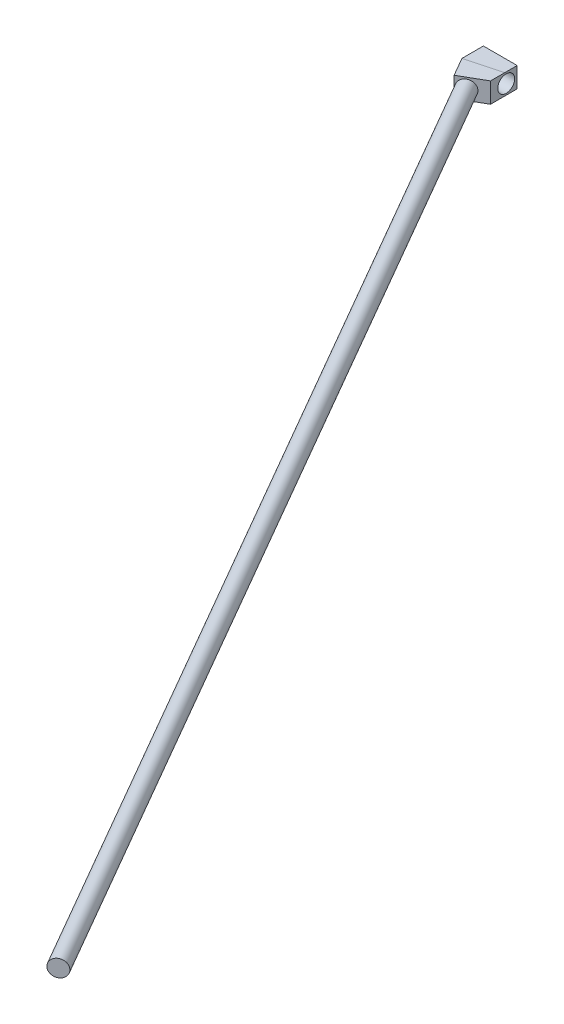
ISO-10303-21;
HEADER;
FILE_DESCRIPTION(('STEP AP214'),'2;1');
FILE_NAME('part.step','',(''),(''),'','','');
FILE_SCHEMA(('AUTOMOTIVE_DESIGN { 1 0 10303 214 1 1 1 1 }'));
ENDSEC;
DATA;
#1=APPLICATION_CONTEXT('core data for automotive mechanical design processes');
#2=APPLICATION_PROTOCOL_DEFINITION('international standard','automotive_design',2000,#1);
#3=PRODUCT_CONTEXT('',#1,'mechanical');
#4=PRODUCT('Part','Part','',(#3));
#5=PRODUCT_RELATED_PRODUCT_CATEGORY('part','',(#4));
#6=PRODUCT_DEFINITION_FORMATION('','',#4);
#7=PRODUCT_DEFINITION_CONTEXT('part definition',#1,'design');
#8=PRODUCT_DEFINITION('design','',#6,#7);
#9=PRODUCT_DEFINITION_SHAPE('','',#8);
#10=(LENGTH_UNIT() NAMED_UNIT(*) SI_UNIT(.MILLI.,.METRE.));
#11=(NAMED_UNIT(*) PLANE_ANGLE_UNIT() SI_UNIT($,.RADIAN.));
#12=(NAMED_UNIT(*) SI_UNIT($,.STERADIAN.) SOLID_ANGLE_UNIT());
#13=UNCERTAINTY_MEASURE_WITH_UNIT(LENGTH_MEASURE(1.E-05),#10,'distance_accuracy_value','');
#14=(GEOMETRIC_REPRESENTATION_CONTEXT(3) GLOBAL_UNCERTAINTY_ASSIGNED_CONTEXT((#13)) GLOBAL_UNIT_ASSIGNED_CONTEXT((#10,
#11,#12)) REPRESENTATION_CONTEXT('',''));
#15=CARTESIAN_POINT('',(0.,0.,0.));
#16=DIRECTION('',(0.,0.,1.));
#17=DIRECTION('',(1.,0.,0.));
#18=AXIS2_PLACEMENT_3D('',#15,#16,#17);
#19=CARTESIAN_POINT('',(2.50000000000001,0.,9.33012701892219));
#20=DIRECTION('',(0.500000000000001,0.,0.866025403784438));
#21=DIRECTION('',(0.866025403784438,0.,-0.500000000000001));
#22=AXIS2_PLACEMENT_3D('',#19,#20,#21);
#23=PLANE('',#22);
#24=CARTESIAN_POINT('',(0.475819659514536,0.,10.4987880833898));
#25=DIRECTION('',(0.500000000000001,0.,0.866025403784438));
#26=DIRECTION('',(0.866025403784438,0.,-0.500000000000001));
#27=AXIS2_PLACEMENT_3D('',#24,#25,#26);
#28=CIRCLE('',#27,2.5);
#29=CARTESIAN_POINT('',(2.64088316897563,0.,9.24878808338983));
#30=VERTEX_POINT('',#29);
#31=EDGE_CURVE('E12',#30,#30,#28,.T.);
#32=ORIENTED_EDGE('',*,*,#31,.F.);
#33=EDGE_LOOP('',(#32));
#34=FACE_BOUND('',#33,.T.);
#35=DIRECTION('',(0.866025403784438,0.,-0.500000000000001));
#36=VECTOR('',#35,1.);
#37=CARTESIAN_POINT('',(-1.83012701892218,-3.,11.8301270189222));
#38=LINE('',#37,#36);
#39=CARTESIAN_POINT('',(-1.83012701892218,-3.,11.8301270189222));
#40=VERTEX_POINT('',#39);
#41=CARTESIAN_POINT('',(5.,-3.,7.88675134594812));
#42=VERTEX_POINT('',#41);
#43=EDGE_CURVE('E126',#40,#42,#38,.T.);
#44=ORIENTED_EDGE('',*,*,#43,.T.);
#45=DIRECTION('',(0.,1.,0.));
#46=VECTOR('',#45,1.);
#47=CARTESIAN_POINT('',(5.,0.,7.88675134594813));
#48=LINE('',#47,#46);
#49=CARTESIAN_POINT('',(5.,3.,7.88675134594813));
#50=VERTEX_POINT('',#49);
#51=EDGE_CURVE('E56',#42,#50,#48,.T.);
#52=ORIENTED_EDGE('',*,*,#51,.T.);
#53=DIRECTION('',(-0.866025403784438,0.,0.500000000000001));
#54=VECTOR('',#53,1.);
#55=CARTESIAN_POINT('',(-1.83012701892218,3.,11.8301270189222));
#56=LINE('',#55,#54);
#57=CARTESIAN_POINT('',(-1.83012701892218,3.,11.8301270189222));
#58=VERTEX_POINT('',#57);
#59=EDGE_CURVE('E124',#50,#58,#56,.T.);
#60=ORIENTED_EDGE('',*,*,#59,.T.);
#61=DIRECTION('',(0.,-1.,0.));
#62=VECTOR('',#61,1.);
#63=CARTESIAN_POINT('',(-1.83012701892218,3.,11.8301270189222));
#64=LINE('',#63,#62);
#65=EDGE_CURVE('E129',#58,#40,#64,.T.);
#66=ORIENTED_EDGE('',*,*,#65,.T.);
#67=EDGE_LOOP('',(#44,#52,#60,#66));
#68=FACE_BOUND('',#67,.T.);
#69=ADVANCED_FACE('F33',(#34,#68),#23,.T.);
#70=CARTESIAN_POINT('',(-5.11698729810778,-3.,6.13711801799273));
#71=DIRECTION('',(0.,-1.,0.));
#72=DIRECTION('',(0.,0.,-1.));
#73=AXIS2_PLACEMENT_3D('',#70,#71,#72);
#74=PLANE('',#73);
#75=DIRECTION('',(-0.965925826289068,0.,0.258819045102522));
#76=VECTOR('',#75,1.);
#77=CARTESIAN_POINT('',(-3.41506350946109,-3.,5.9150635094611));
#78=LINE('',#77,#76);
#79=CARTESIAN_POINT('',(5.,-3.,3.66025403784438));
#80=VERTEX_POINT('',#79);
#81=CARTESIAN_POINT('',(-5.,-3.,6.33974596215562));
#82=VERTEX_POINT('',#81);
#83=EDGE_CURVE('E41',#80,#82,#78,.T.);
#84=ORIENTED_EDGE('',*,*,#83,.F.);
#85=DIRECTION('',(0.,0.,1.));
#86=VECTOR('',#85,1.);
#87=CARTESIAN_POINT('',(5.,-3.,6.13711801799273));
#88=LINE('',#87,#86);
#89=EDGE_CURVE('E49',#80,#42,#88,.T.);
#90=ORIENTED_EDGE('',*,*,#89,.T.);
#91=ORIENTED_EDGE('',*,*,#43,.F.);
#92=DIRECTION('',(0.500000000000001,0.,0.866025403784438));
#93=VECTOR('',#92,1.);
#94=CARTESIAN_POINT('',(-5.11698729810778,-3.,6.13711801799273));
#95=LINE('',#94,#93);
#96=EDGE_CURVE('E130',#82,#40,#95,.T.);
#97=ORIENTED_EDGE('',*,*,#96,.F.);
#98=EDGE_LOOP('',(#84,#90,#91,#97));
#99=FACE_BOUND('',#98,.T.);
#100=ADVANCED_FACE('F141',(#99),#74,.T.);
#101=CARTESIAN_POINT('',(-5.11698729810778,3.,6.13711801799274));
#102=DIRECTION('',(0.,1.,0.));
#103=DIRECTION('',(0.,0.,1.));
#104=AXIS2_PLACEMENT_3D('',#101,#102,#103);
#105=PLANE('',#104);
#106=ORIENTED_EDGE('',*,*,#59,.F.);
#107=DIRECTION('',(0.,0.,-1.));
#108=VECTOR('',#107,1.);
#109=CARTESIAN_POINT('',(5.,3.,6.13711801799274));
#110=LINE('',#109,#108);
#111=CARTESIAN_POINT('',(5.,3.,3.66025403784438));
#112=VERTEX_POINT('',#111);
#113=EDGE_CURVE('E154',#50,#112,#110,.T.);
#114=ORIENTED_EDGE('',*,*,#113,.T.);
#115=DIRECTION('',(0.965925826289068,0.,-0.258819045102522));
#116=VECTOR('',#115,1.);
#117=CARTESIAN_POINT('',(-3.41506350946109,3.,5.9150635094611));
#118=LINE('',#117,#116);
#119=CARTESIAN_POINT('',(-5.,3.,6.33974596215562));
#120=VERTEX_POINT('',#119);
#121=EDGE_CURVE('E123',#120,#112,#118,.T.);
#122=ORIENTED_EDGE('',*,*,#121,.F.);
#123=DIRECTION('',(0.500000000000001,0.,0.866025403784438));
#124=VECTOR('',#123,1.);
#125=CARTESIAN_POINT('',(-5.11698729810778,3.,6.13711801799274));
#126=LINE('',#125,#124);
#127=EDGE_CURVE('E36',#120,#58,#126,.T.);
#128=ORIENTED_EDGE('',*,*,#127,.T.);
#129=EDGE_LOOP('',(#106,#114,#122,#128));
#130=FACE_BOUND('',#129,.T.);
#131=ADVANCED_FACE('F138',(#130),#105,.T.);
#132=CARTESIAN_POINT('',(6.8301270189222,0.,3.24577679774052));
#133=DIRECTION('',(-1.,0.,0.));
#134=DIRECTION('',(0.,-1.,0.));
#135=AXIS2_PLACEMENT_3D('',#132,#133,#134);
#136=CYLINDRICAL_SURFACE('',#135,2.5);
#137=CARTESIAN_POINT('',(-5.,0.,3.24577679774052));
#138=DIRECTION('',(-1.,0.,0.));
#139=DIRECTION('',(0.,-1.,0.));
#140=AXIS2_PLACEMENT_3D('',#137,#138,#139);
#141=CIRCLE('',#140,2.5);
#142=CARTESIAN_POINT('',(-5.,-2.5,3.24577679774052));
#143=VERTEX_POINT('',#142);
#144=EDGE_CURVE('E151',#143,#143,#141,.T.);
#145=ORIENTED_EDGE('',*,*,#144,.T.);
#146=EDGE_LOOP('',(#145));
#147=FACE_BOUND('',#146,.T.);
#148=CARTESIAN_POINT('',(5.,0.,3.24577679774052));
#149=DIRECTION('',(1.,0.,0.));
#150=DIRECTION('',(0.,1.,0.));
#151=AXIS2_PLACEMENT_3D('',#148,#149,#150);
#152=CIRCLE('',#151,2.5);
#153=CARTESIAN_POINT('',(5.,2.5,3.24577679774052));
#154=VERTEX_POINT('',#153);
#155=EDGE_CURVE('E127',#154,#154,#152,.T.);
#156=ORIENTED_EDGE('',*,*,#155,.T.);
#157=EDGE_LOOP('',(#156));
#158=FACE_BOUND('',#157,.T.);
#159=ADVANCED_FACE('F178',(#147,#158),#136,.F.);
#160=CARTESIAN_POINT('',(0.,0.,0.));
#161=DIRECTION('',(0.,0.,1.));
#162=DIRECTION('',(1.,0.,0.));
#163=AXIS2_PLACEMENT_3D('',#160,#161,#162);
#164=PLANE('',#163);
#165=DIRECTION('',(0.,1.,0.));
#166=VECTOR('',#165,1.);
#167=CARTESIAN_POINT('',(5.,3.,0.));
#168=LINE('',#167,#166);
#169=CARTESIAN_POINT('',(5.,-3.,0.));
#170=VERTEX_POINT('',#169);
#171=CARTESIAN_POINT('',(5.,3.,0.));
#172=VERTEX_POINT('',#171);
#173=EDGE_CURVE('E107',#170,#172,#168,.T.);
#174=ORIENTED_EDGE('',*,*,#173,.F.);
#175=DIRECTION('',(1.,0.,0.));
#176=VECTOR('',#175,1.);
#177=CARTESIAN_POINT('',(-5.,-3.,0.));
#178=LINE('',#177,#176);
#179=CARTESIAN_POINT('',(-5.,-3.,0.));
#180=VERTEX_POINT('',#179);
#181=EDGE_CURVE('E93',#180,#170,#178,.T.);
#182=ORIENTED_EDGE('',*,*,#181,.F.);
#183=DIRECTION('',(0.,-1.,0.));
#184=VECTOR('',#183,1.);
#185=CARTESIAN_POINT('',(-5.,3.,0.));
#186=LINE('',#185,#184);
#187=CARTESIAN_POINT('',(-5.,3.,0.));
#188=VERTEX_POINT('',#187);
#189=EDGE_CURVE('E87',#188,#180,#186,.T.);
#190=ORIENTED_EDGE('',*,*,#189,.F.);
#191=DIRECTION('',(-1.,0.,0.));
#192=VECTOR('',#191,1.);
#193=CARTESIAN_POINT('',(-5.,3.,0.));
#194=LINE('',#193,#192);
#195=EDGE_CURVE('E90',#172,#188,#194,.T.);
#196=ORIENTED_EDGE('',*,*,#195,.F.);
#197=EDGE_LOOP('',(#174,#182,#190,#196));
#198=FACE_BOUND('',#197,.T.);
#199=ADVANCED_FACE('F89',(#198),#164,.F.);
#200=CARTESIAN_POINT('',(-5.11698729810778,3.,6.13711801799274));
#201=DIRECTION('',(-0.866025403784438,0.,0.500000000000001));
#202=DIRECTION('',(0.500000000000001,0.,0.866025403784438));
#203=AXIS2_PLACEMENT_3D('',#200,#201,#202);
#204=PLANE('',#203);
#205=DIRECTION('',(0.,1.,0.));
#206=VECTOR('',#205,1.);
#207=CARTESIAN_POINT('',(-5.,3.,6.33974596215562));
#208=LINE('',#207,#206);
#209=EDGE_CURVE('E111',#82,#120,#208,.T.);
#210=ORIENTED_EDGE('',*,*,#209,.F.);
#211=ORIENTED_EDGE('',*,*,#96,.T.);
#212=ORIENTED_EDGE('',*,*,#65,.F.);
#213=ORIENTED_EDGE('',*,*,#127,.F.);
#214=EDGE_LOOP('',(#210,#211,#212,#213));
#215=FACE_BOUND('',#214,.T.);
#216=ADVANCED_FACE('F140',(#215),#204,.T.);
#217=CARTESIAN_POINT('',(-5.,3.,0.));
#218=DIRECTION('',(0.,1.,0.));
#219=DIRECTION('',(0.,0.,1.));
#220=AXIS2_PLACEMENT_3D('',#217,#218,#219);
#221=PLANE('',#220);
#222=DIRECTION('',(0.,0.,1.));
#223=VECTOR('',#222,1.);
#224=CARTESIAN_POINT('',(-5.,3.,0.));
#225=LINE('',#224,#223);
#226=EDGE_CURVE('E104',#188,#120,#225,.T.);
#227=ORIENTED_EDGE('',*,*,#226,.T.);
#228=ORIENTED_EDGE('',*,*,#121,.T.);
#229=DIRECTION('',(0.,0.,1.));
#230=VECTOR('',#229,1.);
#231=CARTESIAN_POINT('',(5.,3.,0.));
#232=LINE('',#231,#230);
#233=EDGE_CURVE('E106',#172,#112,#232,.T.);
#234=ORIENTED_EDGE('',*,*,#233,.F.);
#235=ORIENTED_EDGE('',*,*,#195,.T.);
#236=EDGE_LOOP('',(#227,#228,#234,#235));
#237=FACE_BOUND('',#236,.T.);
#238=ADVANCED_FACE('F102',(#237),#221,.T.);
#239=CARTESIAN_POINT('',(5.,3.,0.));
#240=DIRECTION('',(1.,0.,0.));
#241=DIRECTION('',(0.,1.,0.));
#242=AXIS2_PLACEMENT_3D('',#239,#240,#241);
#243=PLANE('',#242);
#244=ORIENTED_EDGE('',*,*,#89,.F.);
#245=DIRECTION('',(0.,0.,1.));
#246=VECTOR('',#245,1.);
#247=CARTESIAN_POINT('',(5.,-3.,0.));
#248=LINE('',#247,#246);
#249=EDGE_CURVE('E114',#170,#80,#248,.T.);
#250=ORIENTED_EDGE('',*,*,#249,.F.);
#251=ORIENTED_EDGE('',*,*,#173,.T.);
#252=ORIENTED_EDGE('',*,*,#233,.T.);
#253=ORIENTED_EDGE('',*,*,#113,.F.);
#254=ORIENTED_EDGE('',*,*,#51,.F.);
#255=EDGE_LOOP('',(#244,#250,#251,#252,#253,#254));
#256=FACE_BOUND('',#255,.T.);
#257=ORIENTED_EDGE('',*,*,#155,.F.);
#258=EDGE_LOOP('',(#257));
#259=FACE_BOUND('',#258,.T.);
#260=ADVANCED_FACE('F198',(#256,#259),#243,.T.);
#261=CARTESIAN_POINT('',(-5.,-3.,0.));
#262=DIRECTION('',(0.,-1.,0.));
#263=DIRECTION('',(0.,0.,-1.));
#264=AXIS2_PLACEMENT_3D('',#261,#262,#263);
#265=PLANE('',#264);
#266=ORIENTED_EDGE('',*,*,#249,.T.);
#267=ORIENTED_EDGE('',*,*,#83,.T.);
#268=DIRECTION('',(0.,0.,1.));
#269=VECTOR('',#268,1.);
#270=CARTESIAN_POINT('',(-5.,-3.,0.));
#271=LINE('',#270,#269);
#272=EDGE_CURVE('E112',#180,#82,#271,.T.);
#273=ORIENTED_EDGE('',*,*,#272,.F.);
#274=ORIENTED_EDGE('',*,*,#181,.T.);
#275=EDGE_LOOP('',(#266,#267,#273,#274));
#276=FACE_BOUND('',#275,.T.);
#277=ADVANCED_FACE('F144',(#276),#265,.T.);
#278=CARTESIAN_POINT('',(-5.,3.,0.));
#279=DIRECTION('',(-1.,0.,0.));
#280=DIRECTION('',(0.,-1.,0.));
#281=AXIS2_PLACEMENT_3D('',#278,#279,#280);
#282=PLANE('',#281);
#283=ORIENTED_EDGE('',*,*,#144,.F.);
#284=EDGE_LOOP('',(#283));
#285=FACE_BOUND('',#284,.T.);
#286=ORIENTED_EDGE('',*,*,#272,.T.);
#287=ORIENTED_EDGE('',*,*,#209,.T.);
#288=ORIENTED_EDGE('',*,*,#226,.F.);
#289=ORIENTED_EDGE('',*,*,#189,.T.);
#290=EDGE_LOOP('',(#286,#287,#288,#289));
#291=FACE_BOUND('',#290,.T.);
#292=ADVANCED_FACE('F110',(#285,#291),#282,.T.);
#293=CARTESIAN_POINT('',(165.475819659515,0.,296.287171332254));
#294=DIRECTION('',(-0.500000000000001,0.,-0.866025403784438));
#295=DIRECTION('',(-0.866025403784438,0.,0.500000000000001));
#296=AXIS2_PLACEMENT_3D('',#293,#294,#295);
#297=CYLINDRICAL_SURFACE('',#296,2.5);
#298=CARTESIAN_POINT('',(165.475819659515,0.,296.287171332254));
#299=DIRECTION('',(0.500000000000001,0.,0.866025403784438));
#300=DIRECTION('',(0.866025403784438,0.,-0.500000000000001));
#301=AXIS2_PLACEMENT_3D('',#298,#299,#300);
#302=CIRCLE('',#301,2.5);
#303=CARTESIAN_POINT('',(167.640883168976,0.,295.037171332254));
#304=VERTEX_POINT('',#303);
#305=EDGE_CURVE('E157',#304,#304,#302,.T.);
#306=ORIENTED_EDGE('',*,*,#305,.F.);
#307=EDGE_LOOP('',(#306));
#308=FACE_BOUND('',#307,.T.);
#309=ORIENTED_EDGE('',*,*,#31,.T.);
#310=EDGE_LOOP('',(#309));
#311=FACE_BOUND('',#310,.T.);
#312=ADVANCED_FACE('F164',(#308,#311),#297,.T.);
#313=CARTESIAN_POINT('',(165.475819659515,0.,296.287171332254));
#314=DIRECTION('',(0.500000000000001,0.,0.866025403784438));
#315=DIRECTION('',(0.866025403784438,0.,-0.500000000000001));
#316=AXIS2_PLACEMENT_3D('',#313,#314,#315);
#317=PLANE('',#316);
#318=ORIENTED_EDGE('',*,*,#305,.T.);
#319=EDGE_LOOP('',(#318));
#320=FACE_BOUND('',#319,.T.);
#321=ADVANCED_FACE('F162',(#320),#317,.T.);
#322=CLOSED_SHELL('',(#69,#100,#131,#159,#199,#216,#238,#260,#277,#292,#312,#321));
#323=MANIFOLD_SOLID_BREP('B2',#322);
#324=ADVANCED_BREP_SHAPE_REPRESENTATION('',(#18,#323),#14);
#325=SHAPE_DEFINITION_REPRESENTATION(#9,#324);
ENDSEC;
END-ISO-10303-21;
